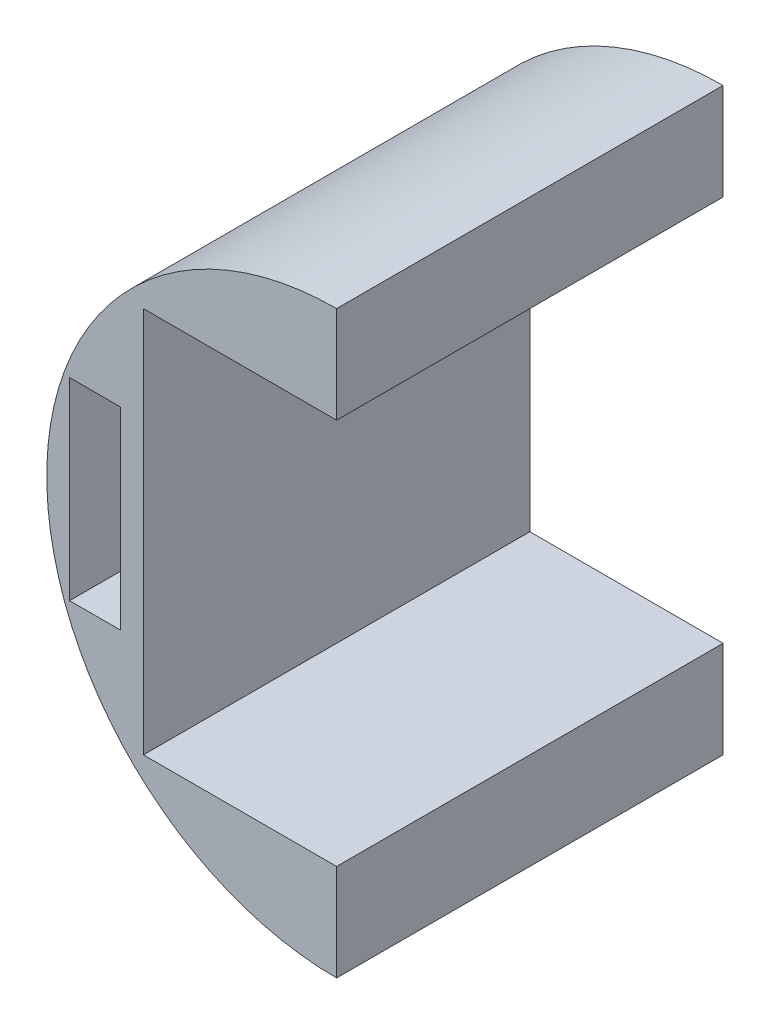
ISO-10303-21;
HEADER;
FILE_DESCRIPTION(('STEP AP214'),'2;1');
FILE_NAME('part.step','',(''),(''),'','','');
FILE_SCHEMA(('AUTOMOTIVE_DESIGN { 1 0 10303 214 1 1 1 1 }'));
ENDSEC;
DATA;
#1=APPLICATION_CONTEXT('core data for automotive mechanical design processes');
#2=APPLICATION_PROTOCOL_DEFINITION('international standard','automotive_design',2000,#1);
#3=PRODUCT_CONTEXT('',#1,'mechanical');
#4=PRODUCT('Part','Part','',(#3));
#5=PRODUCT_RELATED_PRODUCT_CATEGORY('part','',(#4));
#6=PRODUCT_DEFINITION_FORMATION('','',#4);
#7=PRODUCT_DEFINITION_CONTEXT('part definition',#1,'design');
#8=PRODUCT_DEFINITION('design','',#6,#7);
#9=PRODUCT_DEFINITION_SHAPE('','',#8);
#10=(LENGTH_UNIT() NAMED_UNIT(*) SI_UNIT(.MILLI.,.METRE.));
#11=(NAMED_UNIT(*) PLANE_ANGLE_UNIT() SI_UNIT($,.RADIAN.));
#12=(NAMED_UNIT(*) SI_UNIT($,.STERADIAN.) SOLID_ANGLE_UNIT());
#13=UNCERTAINTY_MEASURE_WITH_UNIT(LENGTH_MEASURE(1.E-05),#10,'distance_accuracy_value','');
#14=(GEOMETRIC_REPRESENTATION_CONTEXT(3) GLOBAL_UNCERTAINTY_ASSIGNED_CONTEXT((#13)) GLOBAL_UNIT_ASSIGNED_CONTEXT((#10,
#11,#12)) REPRESENTATION_CONTEXT('',''));
#15=CARTESIAN_POINT('',(0.,0.,0.));
#16=DIRECTION('',(0.,0.,1.));
#17=DIRECTION('',(1.,0.,0.));
#18=AXIS2_PLACEMENT_3D('',#15,#16,#17);
#19=CARTESIAN_POINT('',(0.,0.,20.));
#20=DIRECTION('',(-1.,0.,0.));
#21=DIRECTION('',(0.,0.,1.));
#22=AXIS2_PLACEMENT_3D('',#19,#20,#21);
#23=PLANE('',#22);
#24=DIRECTION('',(0.,1.,0.));
#25=VECTOR('',#24,1.);
#26=CARTESIAN_POINT('',(0.,0.,0.));
#27=LINE('',#26,#25);
#28=CARTESIAN_POINT('',(0.,0.,0.));
#29=VERTEX_POINT('',#28);
#30=CARTESIAN_POINT('',(0.,5.,0.));
#31=VERTEX_POINT('',#30);
#32=EDGE_CURVE('E163',#29,#31,#27,.T.);
#33=ORIENTED_EDGE('',*,*,#32,.T.);
#34=DIRECTION('',(0.,0.,-1.));
#35=VECTOR('',#34,1.);
#36=CARTESIAN_POINT('',(0.,5.,20.));
#37=LINE('',#36,#35);
#38=CARTESIAN_POINT('',(0.,5.,20.));
#39=VERTEX_POINT('',#38);
#40=EDGE_CURVE('E11',#39,#31,#37,.T.);
#41=ORIENTED_EDGE('',*,*,#40,.F.);
#42=DIRECTION('',(0.,1.,0.));
#43=VECTOR('',#42,1.);
#44=CARTESIAN_POINT('',(0.,0.,20.));
#45=LINE('',#44,#43);
#46=CARTESIAN_POINT('',(0.,0.,20.));
#47=VERTEX_POINT('',#46);
#48=EDGE_CURVE('E169',#47,#39,#45,.T.);
#49=ORIENTED_EDGE('',*,*,#48,.F.);
#50=DIRECTION('',(0.,0.,-1.));
#51=VECTOR('',#50,1.);
#52=CARTESIAN_POINT('',(0.,0.,20.));
#53=LINE('',#52,#51);
#54=EDGE_CURVE('E192',#47,#29,#53,.T.);
#55=ORIENTED_EDGE('',*,*,#54,.T.);
#56=EDGE_LOOP('',(#33,#41,#49,#55));
#57=FACE_BOUND('',#56,.T.);
#58=ADVANCED_FACE('F45',(#57),#23,.F.);
#59=CARTESIAN_POINT('',(0.,5.,20.));
#60=DIRECTION('',(0.,-1.,0.));
#61=DIRECTION('',(0.,0.,-1.));
#62=AXIS2_PLACEMENT_3D('',#59,#60,#61);
#63=PLANE('',#62);
#64=DIRECTION('',(-1.,0.,0.));
#65=VECTOR('',#64,1.);
#66=CARTESIAN_POINT('',(0.,5.,0.));
#67=LINE('',#66,#65);
#68=CARTESIAN_POINT('',(-10.,5.,0.));
#69=VERTEX_POINT('',#68);
#70=EDGE_CURVE('E196',#31,#69,#67,.T.);
#71=ORIENTED_EDGE('',*,*,#70,.T.);
#72=DIRECTION('',(0.,0.,-1.));
#73=VECTOR('',#72,1.);
#74=CARTESIAN_POINT('',(-10.,5.,20.));
#75=LINE('',#74,#73);
#76=CARTESIAN_POINT('',(-10.,5.,20.));
#77=VERTEX_POINT('',#76);
#78=EDGE_CURVE('E53',#77,#69,#75,.T.);
#79=ORIENTED_EDGE('',*,*,#78,.F.);
#80=DIRECTION('',(-1.,0.,0.));
#81=VECTOR('',#80,1.);
#82=CARTESIAN_POINT('',(0.,5.,20.));
#83=LINE('',#82,#81);
#84=EDGE_CURVE('E173',#39,#77,#83,.T.);
#85=ORIENTED_EDGE('',*,*,#84,.F.);
#86=ORIENTED_EDGE('',*,*,#40,.T.);
#87=EDGE_LOOP('',(#71,#79,#85,#86));
#88=FACE_BOUND('',#87,.T.);
#89=ADVANCED_FACE('F251',(#88),#63,.F.);
#90=CARTESIAN_POINT('',(-10.,5.,20.));
#91=DIRECTION('',(-1.,0.,0.));
#92=DIRECTION('',(0.,0.,1.));
#93=AXIS2_PLACEMENT_3D('',#90,#91,#92);
#94=PLANE('',#93);
#95=DIRECTION('',(0.,1.,0.));
#96=VECTOR('',#95,1.);
#97=CARTESIAN_POINT('',(-10.,5.,0.));
#98=LINE('',#97,#96);
#99=CARTESIAN_POINT('',(-10.,25.,0.));
#100=VERTEX_POINT('',#99);
#101=EDGE_CURVE('E199',#69,#100,#98,.T.);
#102=ORIENTED_EDGE('',*,*,#101,.T.);
#103=DIRECTION('',(0.,0.,-1.));
#104=VECTOR('',#103,1.);
#105=CARTESIAN_POINT('',(-10.,25.,20.));
#106=LINE('',#105,#104);
#107=CARTESIAN_POINT('',(-10.,25.,20.));
#108=VERTEX_POINT('',#107);
#109=EDGE_CURVE('E222',#108,#100,#106,.T.);
#110=ORIENTED_EDGE('',*,*,#109,.F.);
#111=DIRECTION('',(0.,1.,0.));
#112=VECTOR('',#111,1.);
#113=CARTESIAN_POINT('',(-10.,5.,20.));
#114=LINE('',#113,#112);
#115=EDGE_CURVE('E177',#77,#108,#114,.T.);
#116=ORIENTED_EDGE('',*,*,#115,.F.);
#117=ORIENTED_EDGE('',*,*,#78,.T.);
#118=EDGE_LOOP('',(#102,#110,#116,#117));
#119=FACE_BOUND('',#118,.T.);
#120=ADVANCED_FACE('F230',(#119),#94,.F.);
#121=CARTESIAN_POINT('',(0.,25.,20.));
#122=DIRECTION('',(0.,-1.,0.));
#123=DIRECTION('',(0.,0.,-1.));
#124=AXIS2_PLACEMENT_3D('',#121,#122,#123);
#125=PLANE('',#124);
#126=DIRECTION('',(-1.,0.,0.));
#127=VECTOR('',#126,1.);
#128=CARTESIAN_POINT('',(0.,25.,0.));
#129=LINE('',#128,#127);
#130=CARTESIAN_POINT('',(0.,25.,0.));
#131=VERTEX_POINT('',#130);
#132=EDGE_CURVE('E203',#131,#100,#129,.T.);
#133=ORIENTED_EDGE('',*,*,#132,.F.);
#134=DIRECTION('',(0.,0.,-1.));
#135=VECTOR('',#134,1.);
#136=CARTESIAN_POINT('',(0.,25.,20.));
#137=LINE('',#136,#135);
#138=CARTESIAN_POINT('',(0.,25.,20.));
#139=VERTEX_POINT('',#138);
#140=EDGE_CURVE('E219',#139,#131,#137,.T.);
#141=ORIENTED_EDGE('',*,*,#140,.F.);
#142=DIRECTION('',(-1.,0.,0.));
#143=VECTOR('',#142,1.);
#144=CARTESIAN_POINT('',(0.,25.,20.));
#145=LINE('',#144,#143);
#146=EDGE_CURVE('E180',#139,#108,#145,.T.);
#147=ORIENTED_EDGE('',*,*,#146,.T.);
#148=ORIENTED_EDGE('',*,*,#109,.T.);
#149=EDGE_LOOP('',(#133,#141,#147,#148));
#150=FACE_BOUND('',#149,.T.);
#151=ADVANCED_FACE('F237',(#150),#125,.T.);
#152=CARTESIAN_POINT('',(0.,30.,20.));
#153=DIRECTION('',(1.,0.,0.));
#154=DIRECTION('',(0.,1.,0.));
#155=AXIS2_PLACEMENT_3D('',#152,#153,#154);
#156=PLANE('',#155);
#157=DIRECTION('',(0.,-1.,0.));
#158=VECTOR('',#157,1.);
#159=CARTESIAN_POINT('',(0.,30.,0.));
#160=LINE('',#159,#158);
#161=CARTESIAN_POINT('',(0.,30.,0.));
#162=VERTEX_POINT('',#161);
#163=EDGE_CURVE('E207',#162,#131,#160,.T.);
#164=ORIENTED_EDGE('',*,*,#163,.F.);
#165=DIRECTION('',(0.,0.,-1.));
#166=VECTOR('',#165,1.);
#167=CARTESIAN_POINT('',(0.,30.,20.));
#168=LINE('',#167,#166);
#169=CARTESIAN_POINT('',(0.,30.,20.));
#170=VERTEX_POINT('',#169);
#171=EDGE_CURVE('E216',#170,#162,#168,.T.);
#172=ORIENTED_EDGE('',*,*,#171,.F.);
#173=DIRECTION('',(0.,-1.,0.));
#174=VECTOR('',#173,1.);
#175=CARTESIAN_POINT('',(0.,30.,20.));
#176=LINE('',#175,#174);
#177=EDGE_CURVE('E184',#170,#139,#176,.T.);
#178=ORIENTED_EDGE('',*,*,#177,.T.);
#179=ORIENTED_EDGE('',*,*,#140,.T.);
#180=EDGE_LOOP('',(#164,#172,#178,#179));
#181=FACE_BOUND('',#180,.T.);
#182=ADVANCED_FACE('F244',(#181),#156,.T.);
#183=CARTESIAN_POINT('',(0.,15.,20.));
#184=DIRECTION('',(0.,0.,-1.));
#185=DIRECTION('',(-1.,0.,0.));
#186=AXIS2_PLACEMENT_3D('',#183,#184,#185);
#187=CYLINDRICAL_SURFACE('',#186,15.);
#188=CARTESIAN_POINT('',(0.,15.,0.));
#189=DIRECTION('',(0.,0.,-1.));
#190=DIRECTION('',(-1.,0.,0.));
#191=AXIS2_PLACEMENT_3D('',#188,#189,#190);
#192=CIRCLE('',#191,15.);
#193=EDGE_CURVE('E174',#29,#162,#192,.T.);
#194=ORIENTED_EDGE('',*,*,#193,.F.);
#195=ORIENTED_EDGE('',*,*,#54,.F.);
#196=CARTESIAN_POINT('',(0.,15.,20.));
#197=DIRECTION('',(0.,0.,-1.));
#198=DIRECTION('',(-1.,0.,0.));
#199=AXIS2_PLACEMENT_3D('',#196,#197,#198);
#200=CIRCLE('',#199,15.);
#201=EDGE_CURVE('E188',#47,#170,#200,.T.);
#202=ORIENTED_EDGE('',*,*,#201,.T.);
#203=ORIENTED_EDGE('',*,*,#171,.T.);
#204=EDGE_LOOP('',(#194,#195,#202,#203));
#205=FACE_BOUND('',#204,.T.);
#206=ADVANCED_FACE('F247',(#205),#187,.T.);
#207=CARTESIAN_POINT('',(0.,15.,20.));
#208=DIRECTION('',(0.,0.,-1.));
#209=DIRECTION('',(-1.,0.,0.));
#210=AXIS2_PLACEMENT_3D('',#207,#208,#209);
#211=PLANE('',#210);
#212=DIRECTION('',(0.,1.,0.));
#213=VECTOR('',#212,1.);
#214=CARTESIAN_POINT('',(-11.1803398874989,10.,20.));
#215=LINE('',#214,#213);
#216=CARTESIAN_POINT('',(-11.1803398874989,10.,20.));
#217=VERTEX_POINT('',#216);
#218=CARTESIAN_POINT('',(-11.1803398874989,20.,20.));
#219=VERTEX_POINT('',#218);
#220=EDGE_CURVE('E154',#217,#219,#215,.T.);
#221=ORIENTED_EDGE('',*,*,#220,.F.);
#222=DIRECTION('',(1.,0.,0.));
#223=VECTOR('',#222,1.);
#224=CARTESIAN_POINT('',(-13.8196601125011,10.,20.));
#225=LINE('',#224,#223);
#226=CARTESIAN_POINT('',(-13.8196601125011,10.,20.));
#227=VERTEX_POINT('',#226);
#228=EDGE_CURVE('E60',#227,#217,#225,.T.);
#229=ORIENTED_EDGE('',*,*,#228,.F.);
#230=DIRECTION('',(0.,1.,0.));
#231=VECTOR('',#230,1.);
#232=CARTESIAN_POINT('',(-13.8196601125011,10.,20.));
#233=LINE('',#232,#231);
#234=CARTESIAN_POINT('',(-13.8196601125011,20.,20.));
#235=VERTEX_POINT('',#234);
#236=EDGE_CURVE('E141',#227,#235,#233,.T.);
#237=ORIENTED_EDGE('',*,*,#236,.T.);
#238=DIRECTION('',(1.,0.,0.));
#239=VECTOR('',#238,1.);
#240=CARTESIAN_POINT('',(-13.8196601125011,20.,20.));
#241=LINE('',#240,#239);
#242=EDGE_CURVE('E145',#235,#219,#241,.T.);
#243=ORIENTED_EDGE('',*,*,#242,.T.);
#244=EDGE_LOOP('',(#221,#229,#237,#243));
#245=FACE_BOUND('',#244,.T.);
#246=ORIENTED_EDGE('',*,*,#48,.T.);
#247=ORIENTED_EDGE('',*,*,#84,.T.);
#248=ORIENTED_EDGE('',*,*,#115,.T.);
#249=ORIENTED_EDGE('',*,*,#146,.F.);
#250=ORIENTED_EDGE('',*,*,#177,.F.);
#251=ORIENTED_EDGE('',*,*,#201,.F.);
#252=EDGE_LOOP('',(#246,#247,#248,#249,#250,#251));
#253=FACE_BOUND('',#252,.T.);
#254=ADVANCED_FACE('F241',(#245,#253),#211,.F.);
#255=CARTESIAN_POINT('',(0.,15.,0.));
#256=DIRECTION('',(0.,0.,-1.));
#257=DIRECTION('',(-1.,0.,0.));
#258=AXIS2_PLACEMENT_3D('',#255,#256,#257);
#259=PLANE('',#258);
#260=DIRECTION('',(1.,0.,0.));
#261=VECTOR('',#260,1.);
#262=CARTESIAN_POINT('',(-13.8196601125011,10.,0.));
#263=LINE('',#262,#261);
#264=CARTESIAN_POINT('',(-13.8196601125011,10.,0.));
#265=VERTEX_POINT('',#264);
#266=CARTESIAN_POINT('',(-11.1803398874989,10.,0.));
#267=VERTEX_POINT('',#266);
#268=EDGE_CURVE('E124',#265,#267,#263,.T.);
#269=ORIENTED_EDGE('',*,*,#268,.T.);
#270=DIRECTION('',(0.,1.,0.));
#271=VECTOR('',#270,1.);
#272=CARTESIAN_POINT('',(-11.1803398874989,10.,0.));
#273=LINE('',#272,#271);
#274=CARTESIAN_POINT('',(-11.1803398874989,20.,0.));
#275=VERTEX_POINT('',#274);
#276=EDGE_CURVE('E131',#267,#275,#273,.T.);
#277=ORIENTED_EDGE('',*,*,#276,.T.);
#278=DIRECTION('',(1.,0.,0.));
#279=VECTOR('',#278,1.);
#280=CARTESIAN_POINT('',(-13.8196601125011,20.,0.));
#281=LINE('',#280,#279);
#282=CARTESIAN_POINT('',(-13.8196601125011,20.,0.));
#283=VERTEX_POINT('',#282);
#284=EDGE_CURVE('E136',#283,#275,#281,.T.);
#285=ORIENTED_EDGE('',*,*,#284,.F.);
#286=DIRECTION('',(0.,1.,0.));
#287=VECTOR('',#286,1.);
#288=CARTESIAN_POINT('',(-13.8196601125011,10.,0.));
#289=LINE('',#288,#287);
#290=EDGE_CURVE('E128',#265,#283,#289,.T.);
#291=ORIENTED_EDGE('',*,*,#290,.F.);
#292=EDGE_LOOP('',(#269,#277,#285,#291));
#293=FACE_BOUND('',#292,.T.);
#294=ORIENTED_EDGE('',*,*,#32,.F.);
#295=ORIENTED_EDGE('',*,*,#193,.T.);
#296=ORIENTED_EDGE('',*,*,#163,.T.);
#297=ORIENTED_EDGE('',*,*,#132,.T.);
#298=ORIENTED_EDGE('',*,*,#101,.F.);
#299=ORIENTED_EDGE('',*,*,#70,.F.);
#300=EDGE_LOOP('',(#294,#295,#296,#297,#298,#299));
#301=FACE_BOUND('',#300,.T.);
#302=ADVANCED_FACE('F138',(#293,#301),#259,.T.);
#303=CARTESIAN_POINT('',(-13.8196601125011,10.,0.));
#304=DIRECTION('',(0.,-1.,0.));
#305=DIRECTION('',(0.,0.,-1.));
#306=AXIS2_PLACEMENT_3D('',#303,#304,#305);
#307=PLANE('',#306);
#308=ORIENTED_EDGE('',*,*,#228,.T.);
#309=DIRECTION('',(0.,0.,1.));
#310=VECTOR('',#309,1.);
#311=CARTESIAN_POINT('',(-11.1803398874989,10.,0.));
#312=LINE('',#311,#310);
#313=EDGE_CURVE('E121',#267,#217,#312,.T.);
#314=ORIENTED_EDGE('',*,*,#313,.F.);
#315=ORIENTED_EDGE('',*,*,#268,.F.);
#316=DIRECTION('',(0.,0.,1.));
#317=VECTOR('',#316,1.);
#318=CARTESIAN_POINT('',(-13.8196601125011,10.,0.));
#319=LINE('',#318,#317);
#320=EDGE_CURVE('E160',#265,#227,#319,.T.);
#321=ORIENTED_EDGE('',*,*,#320,.T.);
#322=EDGE_LOOP('',(#308,#314,#315,#321));
#323=FACE_BOUND('',#322,.T.);
#324=ADVANCED_FACE('F122',(#323),#307,.F.);
#325=CARTESIAN_POINT('',(-13.8196601125011,10.,0.));
#326=DIRECTION('',(1.,0.,0.));
#327=DIRECTION('',(0.,0.,-1.));
#328=AXIS2_PLACEMENT_3D('',#325,#326,#327);
#329=PLANE('',#328);
#330=ORIENTED_EDGE('',*,*,#236,.F.);
#331=ORIENTED_EDGE('',*,*,#320,.F.);
#332=ORIENTED_EDGE('',*,*,#290,.T.);
#333=DIRECTION('',(0.,0.,1.));
#334=VECTOR('',#333,1.);
#335=CARTESIAN_POINT('',(-13.8196601125011,20.,0.));
#336=LINE('',#335,#334);
#337=EDGE_CURVE('E164',#283,#235,#336,.T.);
#338=ORIENTED_EDGE('',*,*,#337,.T.);
#339=EDGE_LOOP('',(#330,#331,#332,#338));
#340=FACE_BOUND('',#339,.T.);
#341=ADVANCED_FACE('F272',(#340),#329,.T.);
#342=CARTESIAN_POINT('',(-13.8196601125011,20.,0.));
#343=DIRECTION('',(0.,-1.,0.));
#344=DIRECTION('',(0.,0.,-1.));
#345=AXIS2_PLACEMENT_3D('',#342,#343,#344);
#346=PLANE('',#345);
#347=ORIENTED_EDGE('',*,*,#242,.F.);
#348=ORIENTED_EDGE('',*,*,#337,.F.);
#349=ORIENTED_EDGE('',*,*,#284,.T.);
#350=DIRECTION('',(0.,0.,1.));
#351=VECTOR('',#350,1.);
#352=CARTESIAN_POINT('',(-11.1803398874989,20.,0.));
#353=LINE('',#352,#351);
#354=EDGE_CURVE('E68',#275,#219,#353,.T.);
#355=ORIENTED_EDGE('',*,*,#354,.T.);
#356=EDGE_LOOP('',(#347,#348,#349,#355));
#357=FACE_BOUND('',#356,.T.);
#358=ADVANCED_FACE('F275',(#357),#346,.T.);
#359=CARTESIAN_POINT('',(-11.1803398874989,10.,0.));
#360=DIRECTION('',(1.,0.,0.));
#361=DIRECTION('',(0.,0.,-1.));
#362=AXIS2_PLACEMENT_3D('',#359,#360,#361);
#363=PLANE('',#362);
#364=ORIENTED_EDGE('',*,*,#220,.T.);
#365=ORIENTED_EDGE('',*,*,#354,.F.);
#366=ORIENTED_EDGE('',*,*,#276,.F.);
#367=ORIENTED_EDGE('',*,*,#313,.T.);
#368=EDGE_LOOP('',(#364,#365,#366,#367));
#369=FACE_BOUND('',#368,.T.);
#370=ADVANCED_FACE('F132',(#369),#363,.F.);
#371=CLOSED_SHELL('',(#58,#89,#120,#151,#182,#206,#254,#302,#324,#341,#358,#370));
#372=MANIFOLD_SOLID_BREP('B2',#371);
#373=ADVANCED_BREP_SHAPE_REPRESENTATION('',(#18,#372),#14);
#374=SHAPE_DEFINITION_REPRESENTATION(#9,#373);
ENDSEC;
END-ISO-10303-21;
